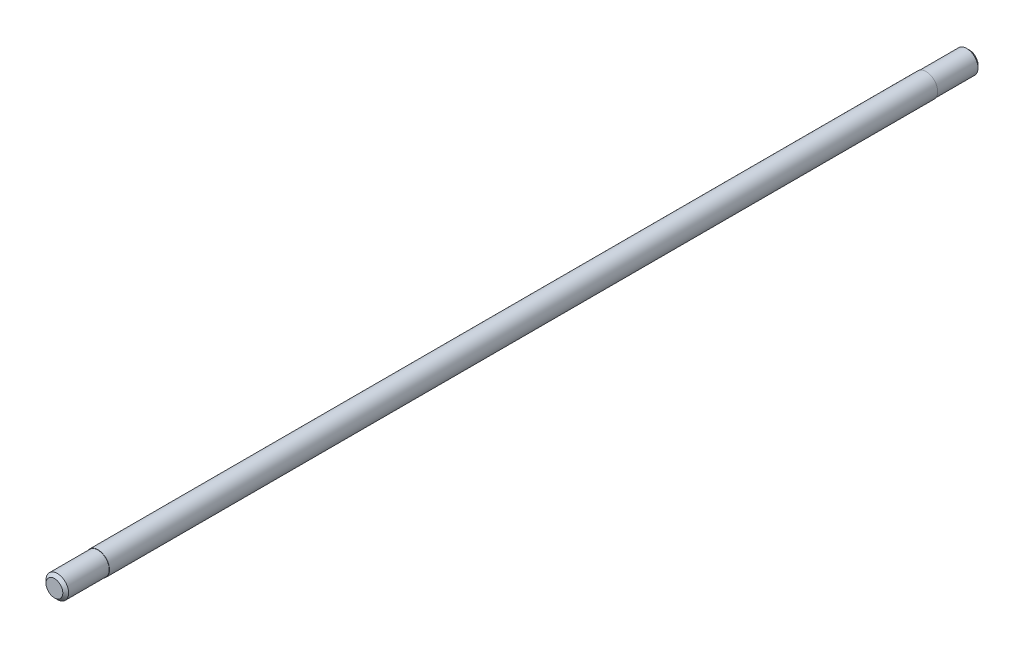
ISO-10303-21;
HEADER;
FILE_DESCRIPTION(('STEP AP214'),'2;1');
FILE_NAME('part.step','',(''),(''),'','','');
FILE_SCHEMA(('AUTOMOTIVE_DESIGN { 1 0 10303 214 1 1 1 1 }'));
ENDSEC;
DATA;
#1=APPLICATION_CONTEXT('core data for automotive mechanical design processes');
#2=APPLICATION_PROTOCOL_DEFINITION('international standard','automotive_design',2000,#1);
#3=PRODUCT_CONTEXT('',#1,'mechanical');
#4=PRODUCT('Part','Part','',(#3));
#5=PRODUCT_RELATED_PRODUCT_CATEGORY('part','',(#4));
#6=PRODUCT_DEFINITION_FORMATION('','',#4);
#7=PRODUCT_DEFINITION_CONTEXT('part definition',#1,'design');
#8=PRODUCT_DEFINITION('design','',#6,#7);
#9=PRODUCT_DEFINITION_SHAPE('','',#8);
#10=(LENGTH_UNIT() NAMED_UNIT(*) SI_UNIT(.MILLI.,.METRE.));
#11=(NAMED_UNIT(*) PLANE_ANGLE_UNIT() SI_UNIT($,.RADIAN.));
#12=(NAMED_UNIT(*) SI_UNIT($,.STERADIAN.) SOLID_ANGLE_UNIT());
#13=UNCERTAINTY_MEASURE_WITH_UNIT(LENGTH_MEASURE(1.E-05),#10,'distance_accuracy_value','');
#14=(GEOMETRIC_REPRESENTATION_CONTEXT(3) GLOBAL_UNCERTAINTY_ASSIGNED_CONTEXT((#13)) GLOBAL_UNIT_ASSIGNED_CONTEXT((#10,
#11,#12)) REPRESENTATION_CONTEXT('',''));
#15=CARTESIAN_POINT('',(0.,0.,0.));
#16=DIRECTION('',(0.,0.,1.));
#17=DIRECTION('',(1.,0.,0.));
#18=AXIS2_PLACEMENT_3D('',#15,#16,#17);
#19=CARTESIAN_POINT('',(0.,0.,1577.5));
#20=DIRECTION('',(0.,0.,1.));
#21=DIRECTION('',(1.,0.,0.));
#22=AXIS2_PLACEMENT_3D('',#19,#20,#21);
#23=PLANE('',#22);
#24=CARTESIAN_POINT('',(0.,0.,1577.5));
#25=DIRECTION('',(0.,0.,-1.));
#26=DIRECTION('',(-1.,0.,0.));
#27=AXIS2_PLACEMENT_3D('',#24,#25,#26);
#28=CIRCLE('',#27,28.9999999999999);
#29=CARTESIAN_POINT('',(-28.9999999999999,0.,1577.5));
#30=VERTEX_POINT('',#29);
#31=EDGE_CURVE('E18',#30,#30,#28,.T.);
#32=ORIENTED_EDGE('',*,*,#31,.F.);
#33=EDGE_LOOP('',(#32));
#34=FACE_BOUND('',#33,.T.);
#35=ADVANCED_FACE('F15',(#34),#23,.T.);
#36=CARTESIAN_POINT('',(0.,0.,-1577.5));
#37=DIRECTION('',(0.,0.,1.));
#38=DIRECTION('',(1.,0.,0.));
#39=AXIS2_PLACEMENT_3D('',#36,#37,#38);
#40=PLANE('',#39);
#41=CARTESIAN_POINT('',(0.,0.,-1577.5));
#42=DIRECTION('',(0.,0.,1.));
#43=DIRECTION('',(1.,0.,0.));
#44=AXIS2_PLACEMENT_3D('',#41,#42,#43);
#45=CIRCLE('',#44,28.9999999999999);
#46=CARTESIAN_POINT('',(28.9999999999999,0.,-1577.5));
#47=VERTEX_POINT('',#46);
#48=EDGE_CURVE('E38',#47,#47,#45,.T.);
#49=ORIENTED_EDGE('',*,*,#48,.F.);
#50=EDGE_LOOP('',(#49));
#51=FACE_BOUND('',#50,.T.);
#52=ADVANCED_FACE('F50',(#51),#40,.F.);
#53=CARTESIAN_POINT('',(0.,0.,1567.5));
#54=DIRECTION('',(0.,0.,-1.));
#55=DIRECTION('',(-1.,0.,0.));
#56=AXIS2_PLACEMENT_3D('',#53,#54,#55);
#57=CONICAL_SURFACE('',#56,39.,0.785398163397441);
#58=ORIENTED_EDGE('',*,*,#31,.T.);
#59=EDGE_LOOP('',(#58));
#60=FACE_BOUND('',#59,.T.);
#61=CARTESIAN_POINT('',(0.,0.,1567.5));
#62=DIRECTION('',(0.,0.,1.));
#63=DIRECTION('',(1.,0.,0.));
#64=AXIS2_PLACEMENT_3D('',#61,#62,#63);
#65=CIRCLE('',#64,39.);
#66=CARTESIAN_POINT('',(39.,0.,1567.5));
#67=VERTEX_POINT('',#66);
#68=EDGE_CURVE('E30',#67,#67,#65,.F.);
#69=ORIENTED_EDGE('',*,*,#68,.F.);
#70=EDGE_LOOP('',(#69));
#71=FACE_BOUND('',#70,.T.);
#72=ADVANCED_FACE('F46',(#60,#71),#57,.T.);
#73=CARTESIAN_POINT('',(0.,0.,-1567.5));
#74=DIRECTION('',(0.,0.,1.));
#75=DIRECTION('',(1.,0.,0.));
#76=AXIS2_PLACEMENT_3D('',#73,#74,#75);
#77=CONICAL_SURFACE('',#76,39.,0.785398163397441);
#78=ORIENTED_EDGE('',*,*,#48,.T.);
#79=EDGE_LOOP('',(#78));
#80=FACE_BOUND('',#79,.T.);
#81=CARTESIAN_POINT('',(0.,0.,-1567.5));
#82=DIRECTION('',(0.,0.,-1.));
#83=DIRECTION('',(-1.,0.,0.));
#84=AXIS2_PLACEMENT_3D('',#81,#82,#83);
#85=CIRCLE('',#84,39.);
#86=CARTESIAN_POINT('',(-39.,0.,-1567.5));
#87=VERTEX_POINT('',#86);
#88=EDGE_CURVE('E37',#87,#87,#85,.F.);
#89=ORIENTED_EDGE('',*,*,#88,.F.);
#90=EDGE_LOOP('',(#89));
#91=FACE_BOUND('',#90,.T.);
#92=ADVANCED_FACE('F78',(#80,#91),#77,.T.);
#93=CARTESIAN_POINT('',(0.,0.,1427.5));
#94=DIRECTION('',(0.,0.,1.));
#95=DIRECTION('',(1.,0.,0.));
#96=AXIS2_PLACEMENT_3D('',#93,#94,#95);
#97=CYLINDRICAL_SURFACE('',#96,39.);
#98=CARTESIAN_POINT('',(0.,0.,1427.5));
#99=DIRECTION('',(0.,0.,1.));
#100=DIRECTION('',(1.,0.,0.));
#101=AXIS2_PLACEMENT_3D('',#98,#99,#100);
#102=CIRCLE('',#101,39.);
#103=CARTESIAN_POINT('',(39.,0.,1427.5));
#104=VERTEX_POINT('',#103);
#105=EDGE_CURVE('E35',#104,#104,#102,.F.);
#106=ORIENTED_EDGE('',*,*,#105,.F.);
#107=EDGE_LOOP('',(#106));
#108=FACE_BOUND('',#107,.T.);
#109=ORIENTED_EDGE('',*,*,#68,.T.);
#110=EDGE_LOOP('',(#109));
#111=FACE_BOUND('',#110,.T.);
#112=ADVANCED_FACE('F74',(#108,#111),#97,.T.);
#113=CARTESIAN_POINT('',(0.,0.,-1427.5));
#114=DIRECTION('',(0.,0.,-1.));
#115=DIRECTION('',(-1.,0.,0.));
#116=AXIS2_PLACEMENT_3D('',#113,#114,#115);
#117=CYLINDRICAL_SURFACE('',#116,39.);
#118=CARTESIAN_POINT('',(0.,0.,-1427.5));
#119=DIRECTION('',(0.,0.,-1.));
#120=DIRECTION('',(-1.,0.,0.));
#121=AXIS2_PLACEMENT_3D('',#118,#119,#120);
#122=CIRCLE('',#121,39.);
#123=CARTESIAN_POINT('',(-39.,0.,-1427.5));
#124=VERTEX_POINT('',#123);
#125=EDGE_CURVE('E27',#124,#124,#122,.F.);
#126=ORIENTED_EDGE('',*,*,#125,.F.);
#127=EDGE_LOOP('',(#126));
#128=FACE_BOUND('',#127,.T.);
#129=ORIENTED_EDGE('',*,*,#88,.T.);
#130=EDGE_LOOP('',(#129));
#131=FACE_BOUND('',#130,.T.);
#132=ADVANCED_FACE('F70',(#128,#131),#117,.T.);
#133=CARTESIAN_POINT('',(0.,0.,1427.5));
#134=DIRECTION('',(0.,0.,1.));
#135=DIRECTION('',(1.,0.,0.));
#136=AXIS2_PLACEMENT_3D('',#133,#134,#135);
#137=PLANE('',#136);
#138=CARTESIAN_POINT('',(0.,0.,1427.5));
#139=DIRECTION('',(0.,0.,-1.));
#140=DIRECTION('',(-1.,0.,0.));
#141=AXIS2_PLACEMENT_3D('',#138,#139,#140);
#142=CIRCLE('',#141,40.);
#143=CARTESIAN_POINT('',(-40.,0.,1427.5));
#144=VERTEX_POINT('',#143);
#145=EDGE_CURVE('E22',#144,#144,#142,.T.);
#146=ORIENTED_EDGE('',*,*,#145,.F.);
#147=EDGE_LOOP('',(#146));
#148=FACE_BOUND('',#147,.T.);
#149=ORIENTED_EDGE('',*,*,#105,.T.);
#150=EDGE_LOOP('',(#149));
#151=FACE_BOUND('',#150,.T.);
#152=ADVANCED_FACE('F63',(#148,#151),#137,.T.);
#153=CARTESIAN_POINT('',(0.,0.,-1427.5));
#154=DIRECTION('',(0.,0.,-1.));
#155=DIRECTION('',(-1.,0.,0.));
#156=AXIS2_PLACEMENT_3D('',#153,#154,#155);
#157=PLANE('',#156);
#158=CARTESIAN_POINT('',(0.,0.,-1427.5));
#159=DIRECTION('',(0.,0.,-1.));
#160=DIRECTION('',(-1.,0.,0.));
#161=AXIS2_PLACEMENT_3D('',#158,#159,#160);
#162=CIRCLE('',#161,40.);
#163=CARTESIAN_POINT('',(-40.,0.,-1427.5));
#164=VERTEX_POINT('',#163);
#165=EDGE_CURVE('E10',#164,#164,#162,.F.);
#166=ORIENTED_EDGE('',*,*,#165,.F.);
#167=EDGE_LOOP('',(#166));
#168=FACE_BOUND('',#167,.T.);
#169=ORIENTED_EDGE('',*,*,#125,.T.);
#170=EDGE_LOOP('',(#169));
#171=FACE_BOUND('',#170,.T.);
#172=ADVANCED_FACE('F58',(#168,#171),#157,.T.);
#173=CARTESIAN_POINT('',(0.,0.,1577.5));
#174=DIRECTION('',(0.,0.,-1.));
#175=DIRECTION('',(-1.,0.,0.));
#176=AXIS2_PLACEMENT_3D('',#173,#174,#175);
#177=CYLINDRICAL_SURFACE('',#176,40.);
#178=ORIENTED_EDGE('',*,*,#165,.T.);
#179=EDGE_LOOP('',(#178));
#180=FACE_BOUND('',#179,.T.);
#181=ORIENTED_EDGE('',*,*,#145,.T.);
#182=EDGE_LOOP('',(#181));
#183=FACE_BOUND('',#182,.T.);
#184=ADVANCED_FACE('F56',(#180,#183),#177,.T.);
#185=CLOSED_SHELL('',(#35,#52,#72,#92,#112,#132,#152,#172,#184));
#186=MANIFOLD_SOLID_BREP('B1',#185);
#187=ADVANCED_BREP_SHAPE_REPRESENTATION('',(#18,#186),#14);
#188=SHAPE_DEFINITION_REPRESENTATION(#9,#187);
ENDSEC;
END-ISO-10303-21;
